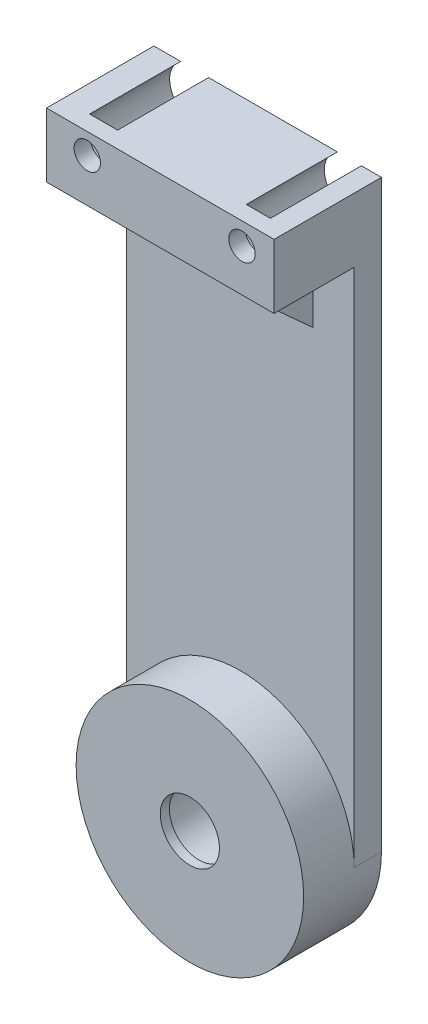
ISO-10303-21;
HEADER;
FILE_DESCRIPTION(('STEP AP214'),'2;1');
FILE_NAME('part.step','',(''),(''),'','','');
FILE_SCHEMA(('AUTOMOTIVE_DESIGN { 1 0 10303 214 1 1 1 1 }'));
ENDSEC;
DATA;
#1=APPLICATION_CONTEXT('core data for automotive mechanical design processes');
#2=APPLICATION_PROTOCOL_DEFINITION('international standard','automotive_design',2000,#1);
#3=PRODUCT_CONTEXT('',#1,'mechanical');
#4=PRODUCT('Part','Part','',(#3));
#5=PRODUCT_RELATED_PRODUCT_CATEGORY('part','',(#4));
#6=PRODUCT_DEFINITION_FORMATION('','',#4);
#7=PRODUCT_DEFINITION_CONTEXT('part definition',#1,'design');
#8=PRODUCT_DEFINITION('design','',#6,#7);
#9=PRODUCT_DEFINITION_SHAPE('','',#8);
#10=(LENGTH_UNIT() NAMED_UNIT(*) SI_UNIT(.MILLI.,.METRE.));
#11=(NAMED_UNIT(*) PLANE_ANGLE_UNIT() SI_UNIT($,.RADIAN.));
#12=(NAMED_UNIT(*) SI_UNIT($,.STERADIAN.) SOLID_ANGLE_UNIT());
#13=UNCERTAINTY_MEASURE_WITH_UNIT(LENGTH_MEASURE(1.E-05),#10,'distance_accuracy_value','');
#14=(GEOMETRIC_REPRESENTATION_CONTEXT(3) GLOBAL_UNCERTAINTY_ASSIGNED_CONTEXT((#13)) GLOBAL_UNIT_ASSIGNED_CONTEXT((#10,
#11,#12)) REPRESENTATION_CONTEXT('',''));
#15=CARTESIAN_POINT('',(0.,0.,0.));
#16=DIRECTION('',(0.,0.,1.));
#17=DIRECTION('',(1.,0.,0.));
#18=AXIS2_PLACEMENT_3D('',#15,#16,#17);
#19=CARTESIAN_POINT('',(0.,57.0691218674891,3.25));
#20=DIRECTION('',(0.,-0.739940073395935,0.672672793996322));
#21=DIRECTION('',(0.,-0.672672793996322,-0.739940073395935));
#22=AXIS2_PLACEMENT_3D('',#19,#20,#21);
#23=PLANE('',#22);
#24=DIRECTION('',(-1.,0.,0.));
#25=VECTOR('',#24,1.);
#26=CARTESIAN_POINT('',(12.0250719766182,57.0691218674891,3.25));
#27=LINE('',#26,#25);
#28=CARTESIAN_POINT('',(7.5,57.0691218674891,3.25));
#29=VERTEX_POINT('',#28);
#30=CARTESIAN_POINT('',(4.5,57.0691218674891,3.25));
#31=VERTEX_POINT('',#30);
#32=EDGE_CURVE('E169',#29,#31,#27,.T.);
#33=ORIENTED_EDGE('',*,*,#32,.T.);
#34=DIRECTION('',(0.,0.672672793996322,0.739940073395935));
#35=VECTOR('',#34,1.);
#36=CARTESIAN_POINT('',(4.5,53.4497101027831,-0.731352941176484));
#37=LINE('',#36,#35);
#38=CARTESIAN_POINT('',(4.5,49.0691218674891,-5.54999999999978));
#39=VERTEX_POINT('',#38);
#40=EDGE_CURVE('E157',#39,#31,#37,.T.);
#41=ORIENTED_EDGE('',*,*,#40,.F.);
#42=DIRECTION('',(-1.,0.,0.));
#43=VECTOR('',#42,1.);
#44=CARTESIAN_POINT('',(-0.47492802338186,49.0691218674891,-5.54999999999978));
#45=LINE('',#44,#43);
#46=CARTESIAN_POINT('',(7.5,49.0691218674891,-5.54999999999978));
#47=VERTEX_POINT('',#46);
#48=EDGE_CURVE('E167',#47,#39,#45,.T.);
#49=ORIENTED_EDGE('',*,*,#48,.F.);
#50=DIRECTION('',(0.,-0.672672793996322,-0.739940073395935));
#51=VECTOR('',#50,1.);
#52=CARTESIAN_POINT('',(7.5,57.0691218674891,3.25));
#53=LINE('',#52,#51);
#54=EDGE_CURVE('E401',#29,#47,#53,.T.);
#55=ORIENTED_EDGE('',*,*,#54,.F.);
#56=EDGE_LOOP('',(#33,#41,#49,#55));
#57=FACE_BOUND('',#56,.T.);
#58=ADVANCED_FACE('F37',(#57),#23,.T.);
#59=CARTESIAN_POINT('',(-4.5,49.0691218674891,-5.54999999999978));
#60=VERTEX_POINT('',#59);
#61=CARTESIAN_POINT('',(-7.5,49.0691218674891,-5.54999999999978));
#62=VERTEX_POINT('',#61);
#63=EDGE_CURVE('E173',#60,#62,#45,.T.);
#64=ORIENTED_EDGE('',*,*,#63,.F.);
#65=DIRECTION('',(0.,-0.672672793996322,-0.739940073395935));
#66=VECTOR('',#65,1.);
#67=CARTESIAN_POINT('',(-4.5,53.4497101027831,-0.731352941176484));
#68=LINE('',#67,#66);
#69=CARTESIAN_POINT('',(-4.5,57.0691218674891,3.25));
#70=VERTEX_POINT('',#69);
#71=EDGE_CURVE('E54',#70,#60,#68,.T.);
#72=ORIENTED_EDGE('',*,*,#71,.F.);
#73=CARTESIAN_POINT('',(-7.5,57.0691218674891,3.25));
#74=VERTEX_POINT('',#73);
#75=EDGE_CURVE('E202',#70,#74,#27,.T.);
#76=ORIENTED_EDGE('',*,*,#75,.T.);
#77=DIRECTION('',(0.,-0.672672793996322,-0.739940073395935));
#78=VECTOR('',#77,1.);
#79=CARTESIAN_POINT('',(-7.5,57.0691218674891,3.25));
#80=LINE('',#79,#78);
#81=EDGE_CURVE('E400',#74,#62,#80,.T.);
#82=ORIENTED_EDGE('',*,*,#81,.T.);
#83=EDGE_LOOP('',(#64,#72,#76,#82));
#84=FACE_BOUND('',#83,.T.);
#85=ADVANCED_FACE('F317',(#84),#23,.T.);
#86=CARTESIAN_POINT('',(12.0250719766182,57.0691218674891,29.2253185801274));
#87=DIRECTION('',(0.,-1.,0.));
#88=DIRECTION('',(0.,0.,-1.));
#89=AXIS2_PLACEMENT_3D('',#86,#87,#88);
#90=PLANE('',#89);
#91=DIRECTION('',(-1.,0.,0.));
#92=VECTOR('',#91,1.);
#93=CARTESIAN_POINT('',(-0.47492802338186,57.0691218674891,-5.54999999999978));
#94=LINE('',#93,#92);
#95=CARTESIAN_POINT('',(-7.5,57.0691218674891,-5.54999999999978));
#96=VERTEX_POINT('',#95);
#97=CARTESIAN_POINT('',(-12.9749280233819,57.0691218674891,-5.54999999999978));
#98=VERTEX_POINT('',#97);
#99=EDGE_CURVE('E248',#96,#98,#94,.T.);
#100=ORIENTED_EDGE('',*,*,#99,.F.);
#101=DIRECTION('',(0.,0.,1.));
#102=VECTOR('',#101,1.);
#103=CARTESIAN_POINT('',(-7.5,57.0691218674891,29.2253185801274));
#104=LINE('',#103,#102);
#105=EDGE_CURVE('E408',#96,#74,#104,.T.);
#106=ORIENTED_EDGE('',*,*,#105,.T.);
#107=CARTESIAN_POINT('',(-12.9749280233819,57.0691218674891,3.25));
#108=VERTEX_POINT('',#107);
#109=EDGE_CURVE('E197',#74,#108,#27,.T.);
#110=ORIENTED_EDGE('',*,*,#109,.T.);
#111=DIRECTION('',(0.,0.,-1.));
#112=VECTOR('',#111,1.);
#113=CARTESIAN_POINT('',(-12.9749280233819,57.0691218674891,29.2253185801274));
#114=LINE('',#113,#112);
#115=EDGE_CURVE('E201',#108,#98,#114,.T.);
#116=ORIENTED_EDGE('',*,*,#115,.T.);
#117=EDGE_LOOP('',(#100,#106,#110,#116));
#118=FACE_BOUND('',#117,.T.);
#119=ADVANCED_FACE('F322',(#118),#90,.T.);
#120=CARTESIAN_POINT('',(-0.474928023381861,-0.0634250947390003,0.));
#121=DIRECTION('',(0.,0.,1.));
#122=DIRECTION('',(1.,0.,0.));
#123=AXIS2_PLACEMENT_3D('',#120,#121,#122);
#124=PLANE('',#123);
#125=CARTESIAN_POINT('',(-0.47492802338186,-0.0634250947390004,0.));
#126=DIRECTION('',(0.,0.,1.));
#127=DIRECTION('',(1.,0.,0.));
#128=AXIS2_PLACEMENT_3D('',#125,#126,#127);
#129=CIRCLE('',#128,3.25);
#130=CARTESIAN_POINT('',(-3.72492802338187,-0.0634250947390004,0.));
#131=VERTEX_POINT('',#130);
#132=EDGE_CURVE('E381',#131,#131,#129,.T.);
#133=ORIENTED_EDGE('',*,*,#132,.F.);
#134=EDGE_LOOP('',(#133));
#135=FACE_BOUND('',#134,.T.);
#136=CARTESIAN_POINT('',(-0.474928023381861,-0.0634250947390003,0.));
#137=DIRECTION('',(0.,0.,1.));
#138=DIRECTION('',(1.,0.,0.));
#139=AXIS2_PLACEMENT_3D('',#136,#137,#138);
#140=CIRCLE('',#139,12.5000000000001);
#141=CARTESIAN_POINT('',(12.0250719766182,-0.0634250947390003,0.));
#142=VERTEX_POINT('',#141);
#143=EDGE_CURVE('E242',#142,#142,#140,.T.);
#144=ORIENTED_EDGE('',*,*,#143,.T.);
#145=EDGE_LOOP('',(#144));
#146=FACE_BOUND('',#145,.T.);
#147=ADVANCED_FACE('F369',(#135,#146),#124,.T.);
#148=CARTESIAN_POINT('',(-0.474928023381861,-0.0634250947390003,-42.9053390593274));
#149=DIRECTION('',(0.,0.,1.));
#150=DIRECTION('',(1.,0.,0.));
#151=AXIS2_PLACEMENT_3D('',#148,#149,#150);
#152=CYLINDRICAL_SURFACE('',#151,12.5000000000001);
#153=ORIENTED_EDGE('',*,*,#143,.F.);
#154=EDGE_LOOP('',(#153));
#155=FACE_BOUND('',#154,.T.);
#156=CARTESIAN_POINT('',(-0.474928023381861,-0.0634250947390003,-5.54999999999978));
#157=DIRECTION('',(0.,0.,-1.));
#158=DIRECTION('',(0.,1.,0.));
#159=AXIS2_PLACEMENT_3D('',#156,#157,#158);
#160=CIRCLE('',#159,12.5000000000001);
#161=CARTESIAN_POINT('',(12.0250719766182,-0.0634250947390005,-5.54999999999978));
#162=VERTEX_POINT('',#161);
#163=CARTESIAN_POINT('',(-12.9749280233819,-0.0634250947390003,-5.54999999999978));
#164=VERTEX_POINT('',#163);
#165=EDGE_CURVE('E245',#162,#164,#160,.F.);
#166=ORIENTED_EDGE('',*,*,#165,.T.);
#167=DIRECTION('',(0.,0.,1.));
#168=VECTOR('',#167,1.);
#169=CARTESIAN_POINT('',(-12.9749280233819,-0.0634250947390005,-8.54999999999978));
#170=LINE('',#169,#168);
#171=CARTESIAN_POINT('',(-12.9749280233819,-0.0634250947390005,-8.54999999999978));
#172=VERTEX_POINT('',#171);
#173=EDGE_CURVE('E240',#172,#164,#170,.T.);
#174=ORIENTED_EDGE('',*,*,#173,.F.);
#175=CARTESIAN_POINT('',(-0.47492802338186,-0.0634250947390005,-8.54999999999978));
#176=DIRECTION('',(0.,0.,-1.));
#177=DIRECTION('',(-1.,0.,0.));
#178=AXIS2_PLACEMENT_3D('',#175,#176,#177);
#179=CIRCLE('',#178,12.5000000000001);
#180=CARTESIAN_POINT('',(12.0250719766182,-0.0634250947390005,-8.54999999999978));
#181=VERTEX_POINT('',#180);
#182=EDGE_CURVE('E216',#181,#172,#179,.T.);
#183=ORIENTED_EDGE('',*,*,#182,.F.);
#184=DIRECTION('',(0.,0.,1.));
#185=VECTOR('',#184,1.);
#186=CARTESIAN_POINT('',(12.0250719766182,-0.0634250947390005,-8.54999999999978));
#187=LINE('',#186,#185);
#188=EDGE_CURVE('E229',#181,#162,#187,.T.);
#189=ORIENTED_EDGE('',*,*,#188,.T.);
#190=EDGE_LOOP('',(#166,#174,#183,#189));
#191=FACE_BOUND('',#190,.T.);
#192=ADVANCED_FACE('F39',(#155,#191),#152,.T.);
#193=CARTESIAN_POINT('',(-12.9749280233819,-0.0634250947390005,-8.54999999999978));
#194=DIRECTION('',(1.,0.,0.));
#195=DIRECTION('',(0.,0.,-1.));
#196=AXIS2_PLACEMENT_3D('',#193,#194,#195);
#197=PLANE('',#196);
#198=DIRECTION('',(0.,1.,0.));
#199=VECTOR('',#198,1.);
#200=CARTESIAN_POINT('',(-12.9749280233819,-0.0634250947390005,-5.54999999999978));
#201=LINE('',#200,#199);
#202=EDGE_CURVE('E215',#164,#98,#201,.T.);
#203=ORIENTED_EDGE('',*,*,#202,.T.);
#204=ORIENTED_EDGE('',*,*,#115,.F.);
#205=DIRECTION('',(0.,1.,0.));
#206=VECTOR('',#205,1.);
#207=CARTESIAN_POINT('',(-12.9749280233819,57.0691218674891,3.25));
#208=LINE('',#207,#206);
#209=CARTESIAN_POINT('',(-12.9749280233819,64.1201625948642,3.25));
#210=VERTEX_POINT('',#209);
#211=EDGE_CURVE('E209',#108,#210,#208,.T.);
#212=ORIENTED_EDGE('',*,*,#211,.T.);
#213=DIRECTION('',(0.,0.,1.));
#214=VECTOR('',#213,1.);
#215=CARTESIAN_POINT('',(-12.9749280233819,64.1201625948642,-8.54999999999978));
#216=LINE('',#215,#214);
#217=CARTESIAN_POINT('',(-12.9749280233819,64.1201625948642,-8.54999999999978));
#218=VERTEX_POINT('',#217);
#219=EDGE_CURVE('E238',#218,#210,#216,.T.);
#220=ORIENTED_EDGE('',*,*,#219,.F.);
#221=DIRECTION('',(0.,1.,0.));
#222=VECTOR('',#221,1.);
#223=CARTESIAN_POINT('',(-12.9749280233819,-0.0634250947390005,-8.54999999999978));
#224=LINE('',#223,#222);
#225=EDGE_CURVE('E219',#172,#218,#224,.T.);
#226=ORIENTED_EDGE('',*,*,#225,.F.);
#227=ORIENTED_EDGE('',*,*,#173,.T.);
#228=EDGE_LOOP('',(#203,#204,#212,#220,#226,#227));
#229=FACE_BOUND('',#228,.T.);
#230=ADVANCED_FACE('F292',(#229),#197,.F.);
#231=CARTESIAN_POINT('',(-12.9749280233819,64.1201625948642,-8.54999999999978));
#232=DIRECTION('',(0.,-1.,0.));
#233=DIRECTION('',(0.,0.,-1.));
#234=AXIS2_PLACEMENT_3D('',#231,#232,#233);
#235=PLANE('',#234);
#236=DIRECTION('',(-1.,0.,0.));
#237=VECTOR('',#236,1.);
#238=CARTESIAN_POINT('',(-12.9749280233819,64.1201625948642,1.45000000000022));
#239=LINE('',#238,#237);
#240=CARTESIAN_POINT('',(9.81969619357984,64.1201625948642,1.45000000000022));
#241=VERTEX_POINT('',#240);
#242=CARTESIAN_POINT('',(7.17930210556199,64.1201625948642,1.45000000000022));
#243=VERTEX_POINT('',#242);
#244=EDGE_CURVE('E259',#241,#243,#239,.T.);
#245=ORIENTED_EDGE('',*,*,#244,.T.);
#246=DIRECTION('',(0.,0.,-1.));
#247=VECTOR('',#246,1.);
#248=CARTESIAN_POINT('',(7.17930210556198,64.1201625948642,-8.54999999999978));
#249=LINE('',#248,#247);
#250=CARTESIAN_POINT('',(7.17930210556198,64.1201625948642,-8.54999999999978));
#251=VERTEX_POINT('',#250);
#252=EDGE_CURVE('E46',#243,#251,#249,.T.);
#253=ORIENTED_EDGE('',*,*,#252,.T.);
#254=DIRECTION('',(1.,0.,0.));
#255=VECTOR('',#254,1.);
#256=CARTESIAN_POINT('',(-12.9749280233819,64.1201625948642,-8.54999999999978));
#257=LINE('',#256,#255);
#258=CARTESIAN_POINT('',(-6.96523827191302,64.1201625948642,-8.54999999999978));
#259=VERTEX_POINT('',#258);
#260=EDGE_CURVE('E227',#259,#251,#257,.T.);
#261=ORIENTED_EDGE('',*,*,#260,.F.);
#262=DIRECTION('',(0.,0.,-1.));
#263=VECTOR('',#262,1.);
#264=CARTESIAN_POINT('',(-6.96523827191302,64.1201625948642,-8.54999999999978));
#265=LINE('',#264,#263);
#266=CARTESIAN_POINT('',(-6.96523827191302,64.1201625948642,1.45000000000022));
#267=VERTEX_POINT('',#266);
#268=EDGE_CURVE('E251',#259,#267,#265,.F.);
#269=ORIENTED_EDGE('',*,*,#268,.T.);
#270=DIRECTION('',(-1.,0.,0.));
#271=VECTOR('',#270,1.);
#272=CARTESIAN_POINT('',(-12.9749280233819,64.1201625948642,1.45000000000022));
#273=LINE('',#272,#271);
#274=CARTESIAN_POINT('',(-10.0347617280894,64.1201625948642,1.45000000000022));
#275=VERTEX_POINT('',#274);
#276=EDGE_CURVE('E254',#267,#275,#273,.T.);
#277=ORIENTED_EDGE('',*,*,#276,.T.);
#278=DIRECTION('',(0.,0.,-1.));
#279=VECTOR('',#278,1.);
#280=CARTESIAN_POINT('',(-10.0347617280894,64.1201625948642,-8.54999999999978));
#281=LINE('',#280,#279);
#282=CARTESIAN_POINT('',(-10.0347617280894,64.1201625948642,-8.54999999999978));
#283=VERTEX_POINT('',#282);
#284=EDGE_CURVE('E256',#275,#283,#281,.T.);
#285=ORIENTED_EDGE('',*,*,#284,.T.);
#286=EDGE_CURVE('E223',#218,#283,#257,.T.);
#287=ORIENTED_EDGE('',*,*,#286,.F.);
#288=ORIENTED_EDGE('',*,*,#219,.T.);
#289=DIRECTION('',(1.,0.,0.));
#290=VECTOR('',#289,1.);
#291=CARTESIAN_POINT('',(12.0250719766182,64.1201625948642,3.24999999999999));
#292=LINE('',#291,#290);
#293=CARTESIAN_POINT('',(12.0250719766182,64.1201625948642,3.24999999999999));
#294=VERTEX_POINT('',#293);
#295=EDGE_CURVE('E207',#210,#294,#292,.T.);
#296=ORIENTED_EDGE('',*,*,#295,.T.);
#297=DIRECTION('',(0.,0.,1.));
#298=VECTOR('',#297,1.);
#299=CARTESIAN_POINT('',(12.0250719766182,64.1201625948642,-8.54999999999978));
#300=LINE('',#299,#298);
#301=CARTESIAN_POINT('',(12.0250719766182,64.1201625948642,-8.54999999999978));
#302=VERTEX_POINT('',#301);
#303=EDGE_CURVE('E235',#302,#294,#300,.T.);
#304=ORIENTED_EDGE('',*,*,#303,.F.);
#305=CARTESIAN_POINT('',(9.81969619357984,64.1201625948642,-8.54999999999978));
#306=VERTEX_POINT('',#305);
#307=EDGE_CURVE('E222',#306,#302,#257,.T.);
#308=ORIENTED_EDGE('',*,*,#307,.F.);
#309=DIRECTION('',(0.,0.,-1.));
#310=VECTOR('',#309,1.);
#311=CARTESIAN_POINT('',(9.81969619357984,64.1201625948642,-8.54999999999978));
#312=LINE('',#311,#310);
#313=EDGE_CURVE('E262',#306,#241,#312,.F.);
#314=ORIENTED_EDGE('',*,*,#313,.T.);
#315=EDGE_LOOP('',(#245,#253,#261,#269,#277,#285,#287,#288,#296,#304,#308,#314));
#316=FACE_BOUND('',#315,.T.);
#317=ADVANCED_FACE('F269',(#316),#235,.F.);
#318=CARTESIAN_POINT('',(12.0250719766182,-0.0634250947390005,-8.54999999999978));
#319=DIRECTION('',(-1.,0.,0.));
#320=DIRECTION('',(0.,0.,1.));
#321=AXIS2_PLACEMENT_3D('',#318,#319,#320);
#322=PLANE('',#321);
#323=ORIENTED_EDGE('',*,*,#188,.F.);
#324=DIRECTION('',(0.,-1.,0.));
#325=VECTOR('',#324,1.);
#326=CARTESIAN_POINT('',(12.0250719766182,-0.0634250947390005,-8.54999999999978));
#327=LINE('',#326,#325);
#328=EDGE_CURVE('E226',#302,#181,#327,.T.);
#329=ORIENTED_EDGE('',*,*,#328,.F.);
#330=ORIENTED_EDGE('',*,*,#303,.T.);
#331=DIRECTION('',(0.,-1.,0.));
#332=VECTOR('',#331,1.);
#333=CARTESIAN_POINT('',(12.0250719766182,64.1201625948642,3.24999999999999));
#334=LINE('',#333,#332);
#335=CARTESIAN_POINT('',(12.0250719766182,57.0691218674891,3.25));
#336=VERTEX_POINT('',#335);
#337=EDGE_CURVE('E203',#294,#336,#334,.T.);
#338=ORIENTED_EDGE('',*,*,#337,.T.);
#339=DIRECTION('',(0.,0.,-1.));
#340=VECTOR('',#339,1.);
#341=CARTESIAN_POINT('',(12.0250719766182,57.0691218674891,29.2253185801274));
#342=LINE('',#341,#340);
#343=CARTESIAN_POINT('',(12.0250719766182,57.0691218674891,-5.54999999999978));
#344=VERTEX_POINT('',#343);
#345=EDGE_CURVE('E206',#336,#344,#342,.T.);
#346=ORIENTED_EDGE('',*,*,#345,.T.);
#347=DIRECTION('',(0.,-1.,0.));
#348=VECTOR('',#347,1.);
#349=CARTESIAN_POINT('',(12.0250719766182,-0.0634250947390005,-5.54999999999978));
#350=LINE('',#349,#348);
#351=EDGE_CURVE('E220',#344,#162,#350,.T.);
#352=ORIENTED_EDGE('',*,*,#351,.T.);
#353=EDGE_LOOP('',(#323,#329,#330,#338,#346,#352));
#354=FACE_BOUND('',#353,.T.);
#355=ADVANCED_FACE('F283',(#354),#322,.F.);
#356=CARTESIAN_POINT('',(-0.47492802338186,-0.0634250947390005,-8.54999999999978));
#357=DIRECTION('',(0.,0.,-1.));
#358=DIRECTION('',(-1.,0.,0.));
#359=AXIS2_PLACEMENT_3D('',#356,#357,#358);
#360=PLANE('',#359);
#361=CARTESIAN_POINT('',(-0.47492802338186,-0.0634250947390004,-8.54999999999978));
#362=DIRECTION('',(0.,0.,-1.));
#363=DIRECTION('',(-1.,0.,0.));
#364=AXIS2_PLACEMENT_3D('',#361,#362,#363);
#365=CIRCLE('',#364,4.00000000000001);
#366=CARTESIAN_POINT('',(-4.47492802338187,-0.0634250947390004,-8.54999999999978));
#367=VERTEX_POINT('',#366);
#368=EDGE_CURVE('E450',#367,#367,#365,.T.);
#369=ORIENTED_EDGE('',*,*,#368,.F.);
#370=EDGE_LOOP('',(#369));
#371=FACE_BOUND('',#370,.T.);
#372=ORIENTED_EDGE('',*,*,#260,.T.);
#373=CARTESIAN_POINT('',(8.49949914957091,61.7077820765815,-8.54999999999978));
#374=DIRECTION('',(0.,0.,-1.));
#375=DIRECTION('',(-1.,0.,0.));
#376=AXIS2_PLACEMENT_3D('',#373,#374,#375);
#377=CIRCLE('',#376,2.75);
#378=EDGE_CURVE('E12',#306,#251,#377,.T.);
#379=ORIENTED_EDGE('',*,*,#378,.F.);
#380=ORIENTED_EDGE('',*,*,#307,.T.);
#381=ORIENTED_EDGE('',*,*,#328,.T.);
#382=ORIENTED_EDGE('',*,*,#182,.T.);
#383=ORIENTED_EDGE('',*,*,#225,.T.);
#384=ORIENTED_EDGE('',*,*,#286,.T.);
#385=CARTESIAN_POINT('',(-8.50000000000123,61.838275998647,-8.54999999999978));
#386=DIRECTION('',(0.,0.,-1.));
#387=DIRECTION('',(-1.,0.,0.));
#388=AXIS2_PLACEMENT_3D('',#385,#386,#387);
#389=CIRCLE('',#388,2.75);
#390=EDGE_CURVE('E186',#259,#283,#389,.T.);
#391=ORIENTED_EDGE('',*,*,#390,.F.);
#392=EDGE_LOOP('',(#372,#379,#380,#381,#382,#383,#384,#391));
#393=FACE_BOUND('',#392,.T.);
#394=ADVANCED_FACE('F275',(#371,#393),#360,.T.);
#395=CARTESIAN_POINT('',(-0.47492802338186,-0.0634250947390005,-5.54999999999978));
#396=DIRECTION('',(0.,0.,-1.));
#397=DIRECTION('',(-1.,0.,0.));
#398=AXIS2_PLACEMENT_3D('',#395,#396,#397);
#399=PLANE('',#398);
#400=CARTESIAN_POINT('',(7.5,57.0691218674891,-5.54999999999978));
#401=VERTEX_POINT('',#400);
#402=EDGE_CURVE('E249',#344,#401,#94,.T.);
#403=ORIENTED_EDGE('',*,*,#402,.T.);
#404=DIRECTION('',(0.,-1.,0.));
#405=VECTOR('',#404,1.);
#406=CARTESIAN_POINT('',(7.5,-0.0634250947390005,-5.54999999999978));
#407=LINE('',#406,#405);
#408=EDGE_CURVE('E62',#401,#47,#407,.T.);
#409=ORIENTED_EDGE('',*,*,#408,.T.);
#410=ORIENTED_EDGE('',*,*,#48,.T.);
#411=DIRECTION('',(0.,1.,0.));
#412=VECTOR('',#411,1.);
#413=CARTESIAN_POINT('',(4.5,49.0691218674891,-5.54999999999978));
#414=LINE('',#413,#412);
#415=CARTESIAN_POINT('',(4.5,57.0691218674891,-5.54999999999978));
#416=VERTEX_POINT('',#415);
#417=EDGE_CURVE('E154',#39,#416,#414,.T.);
#418=ORIENTED_EDGE('',*,*,#417,.T.);
#419=DIRECTION('',(-1.,0.,0.));
#420=VECTOR('',#419,1.);
#421=CARTESIAN_POINT('',(4.5,57.0691218674891,-5.54999999999978));
#422=LINE('',#421,#420);
#423=CARTESIAN_POINT('',(-4.5,57.0691218674891,-5.54999999999978));
#424=VERTEX_POINT('',#423);
#425=EDGE_CURVE('E162',#416,#424,#422,.T.);
#426=ORIENTED_EDGE('',*,*,#425,.T.);
#427=DIRECTION('',(0.,-1.,0.));
#428=VECTOR('',#427,1.);
#429=CARTESIAN_POINT('',(-4.49999999999999,49.0691218674891,-5.54999999999978));
#430=LINE('',#429,#428);
#431=EDGE_CURVE('E395',#424,#60,#430,.T.);
#432=ORIENTED_EDGE('',*,*,#431,.T.);
#433=ORIENTED_EDGE('',*,*,#63,.T.);
#434=DIRECTION('',(0.,-1.,0.));
#435=VECTOR('',#434,1.);
#436=CARTESIAN_POINT('',(-7.5,-0.0634250947390005,-5.54999999999978));
#437=LINE('',#436,#435);
#438=EDGE_CURVE('E177',#96,#62,#437,.T.);
#439=ORIENTED_EDGE('',*,*,#438,.F.);
#440=ORIENTED_EDGE('',*,*,#99,.T.);
#441=ORIENTED_EDGE('',*,*,#202,.F.);
#442=ORIENTED_EDGE('',*,*,#165,.F.);
#443=ORIENTED_EDGE('',*,*,#351,.F.);
#444=EDGE_LOOP('',(#403,#409,#410,#418,#426,#432,#433,#439,#440,#441,#442,#443));
#445=FACE_BOUND('',#444,.T.);
#446=ADVANCED_FACE('F171',(#445),#399,.F.);
#447=DIRECTION('',(0.,0.,1.));
#448=VECTOR('',#447,1.);
#449=CARTESIAN_POINT('',(7.5,57.0691218674891,29.2253185801274));
#450=LINE('',#449,#448);
#451=EDGE_CURVE('E403',#401,#29,#450,.T.);
#452=ORIENTED_EDGE('',*,*,#451,.F.);
#453=ORIENTED_EDGE('',*,*,#402,.F.);
#454=ORIENTED_EDGE('',*,*,#345,.F.);
#455=EDGE_CURVE('E198',#336,#29,#27,.T.);
#456=ORIENTED_EDGE('',*,*,#455,.T.);
#457=EDGE_LOOP('',(#452,#453,#454,#456));
#458=FACE_BOUND('',#457,.T.);
#459=ADVANCED_FACE('F311',(#458),#90,.T.);
#460=CARTESIAN_POINT('',(-18.5409663715559,58.1032415509736,3.25));
#461=DIRECTION('',(0.,0.,1.));
#462=DIRECTION('',(0.999970538210126,-0.00767611306267934,0.));
#463=AXIS2_PLACEMENT_3D('',#460,#461,#462);
#464=PLANE('',#463);
#465=CARTESIAN_POINT('',(8.49949914957091,61.7077820765815,3.24999999999999));
#466=DIRECTION('',(0.,0.,1.));
#467=DIRECTION('',(1.,0.,0.));
#468=AXIS2_PLACEMENT_3D('',#465,#466,#467);
#469=CIRCLE('',#468,1.45);
#470=CARTESIAN_POINT('',(9.94949914957091,61.7077820765815,3.24999999999999));
#471=VERTEX_POINT('',#470);
#472=EDGE_CURVE('E183',#471,#471,#469,.T.);
#473=ORIENTED_EDGE('',*,*,#472,.F.);
#474=EDGE_LOOP('',(#473));
#475=FACE_BOUND('',#474,.T.);
#476=ORIENTED_EDGE('',*,*,#32,.F.);
#477=ORIENTED_EDGE('',*,*,#455,.F.);
#478=ORIENTED_EDGE('',*,*,#337,.F.);
#479=ORIENTED_EDGE('',*,*,#295,.F.);
#480=ORIENTED_EDGE('',*,*,#211,.F.);
#481=ORIENTED_EDGE('',*,*,#109,.F.);
#482=ORIENTED_EDGE('',*,*,#75,.F.);
#483=DIRECTION('',(-1.,0.,0.));
#484=VECTOR('',#483,1.);
#485=CARTESIAN_POINT('',(12.0250719766182,57.0691218674891,3.25));
#486=LINE('',#485,#484);
#487=EDGE_CURVE('E384',#31,#70,#486,.T.);
#488=ORIENTED_EDGE('',*,*,#487,.F.);
#489=EDGE_LOOP('',(#476,#477,#478,#479,#480,#481,#482,#488));
#490=FACE_BOUND('',#489,.T.);
#491=CARTESIAN_POINT('',(-8.50000000000123,61.838275998647,3.25));
#492=DIRECTION('',(0.,0.,1.));
#493=DIRECTION('',(1.,0.,0.));
#494=AXIS2_PLACEMENT_3D('',#491,#492,#493);
#495=CIRCLE('',#494,1.45);
#496=CARTESIAN_POINT('',(-7.05000000000123,61.838275998647,3.25));
#497=VERTEX_POINT('',#496);
#498=EDGE_CURVE('E194',#497,#497,#495,.T.);
#499=ORIENTED_EDGE('',*,*,#498,.F.);
#500=EDGE_LOOP('',(#499));
#501=FACE_BOUND('',#500,.T.);
#502=ADVANCED_FACE('F302',(#475,#490,#501),#464,.T.);
#503=CARTESIAN_POINT('',(-7.05000000000123,61.838275998647,1.45000000000022));
#504=DIRECTION('',(0.,0.,1.));
#505=DIRECTION('',(1.,0.,0.));
#506=AXIS2_PLACEMENT_3D('',#503,#504,#505);
#507=PLANE('',#506);
#508=CARTESIAN_POINT('',(-8.50000000000123,61.838275998647,1.45000000000022));
#509=DIRECTION('',(0.,0.,-1.));
#510=DIRECTION('',(-1.,0.,0.));
#511=AXIS2_PLACEMENT_3D('',#508,#509,#510);
#512=CIRCLE('',#511,1.45);
#513=CARTESIAN_POINT('',(-9.95000000000123,61.838275998647,1.45000000000022));
#514=VERTEX_POINT('',#513);
#515=EDGE_CURVE('E191',#514,#514,#512,.T.);
#516=ORIENTED_EDGE('',*,*,#515,.F.);
#517=EDGE_LOOP('',(#516));
#518=FACE_BOUND('',#517,.T.);
#519=CARTESIAN_POINT('',(-8.50000000000123,61.838275998647,1.45000000000022));
#520=DIRECTION('',(0.,0.,-1.));
#521=DIRECTION('',(-1.,0.,0.));
#522=AXIS2_PLACEMENT_3D('',#519,#520,#521);
#523=CIRCLE('',#522,2.75);
#524=EDGE_CURVE('E188',#267,#275,#523,.T.);
#525=ORIENTED_EDGE('',*,*,#524,.T.);
#526=ORIENTED_EDGE('',*,*,#276,.F.);
#527=EDGE_LOOP('',(#525,#526));
#528=FACE_BOUND('',#527,.T.);
#529=ADVANCED_FACE('F300',(#518,#528),#507,.F.);
#530=CARTESIAN_POINT('',(-8.50000000000123,61.838275998647,-8.54999999999978));
#531=DIRECTION('',(0.,0.,-1.));
#532=DIRECTION('',(-1.,0.,0.));
#533=AXIS2_PLACEMENT_3D('',#530,#531,#532);
#534=CYLINDRICAL_SURFACE('',#533,2.75);
#535=ORIENTED_EDGE('',*,*,#390,.T.);
#536=ORIENTED_EDGE('',*,*,#284,.F.);
#537=ORIENTED_EDGE('',*,*,#524,.F.);
#538=ORIENTED_EDGE('',*,*,#268,.F.);
#539=EDGE_LOOP('',(#535,#536,#537,#538));
#540=FACE_BOUND('',#539,.T.);
#541=ADVANCED_FACE('F298',(#540),#534,.F.);
#542=CARTESIAN_POINT('',(-8.50000000000123,61.838275998647,-8.54999999999978));
#543=DIRECTION('',(0.,0.,-1.));
#544=DIRECTION('',(-1.,0.,0.));
#545=AXIS2_PLACEMENT_3D('',#542,#543,#544);
#546=CYLINDRICAL_SURFACE('',#545,1.45);
#547=ORIENTED_EDGE('',*,*,#498,.T.);
#548=EDGE_LOOP('',(#547));
#549=FACE_BOUND('',#548,.T.);
#550=ORIENTED_EDGE('',*,*,#515,.T.);
#551=EDGE_LOOP('',(#550));
#552=FACE_BOUND('',#551,.T.);
#553=ADVANCED_FACE('F309',(#549,#552),#546,.F.);
#554=CARTESIAN_POINT('',(8.49949914957091,61.7077820765815,-8.54999999999978));
#555=DIRECTION('',(0.,0.,-1.));
#556=DIRECTION('',(-1.,0.,0.));
#557=AXIS2_PLACEMENT_3D('',#554,#555,#556);
#558=CYLINDRICAL_SURFACE('',#557,2.75);
#559=ORIENTED_EDGE('',*,*,#378,.T.);
#560=ORIENTED_EDGE('',*,*,#252,.F.);
#561=CARTESIAN_POINT('',(8.49949914957091,61.7077820765815,1.45000000000022));
#562=DIRECTION('',(0.,0.,-1.));
#563=DIRECTION('',(-1.,0.,0.));
#564=AXIS2_PLACEMENT_3D('',#561,#562,#563);
#565=CIRCLE('',#564,2.75);
#566=EDGE_CURVE('E172',#241,#243,#565,.T.);
#567=ORIENTED_EDGE('',*,*,#566,.F.);
#568=ORIENTED_EDGE('',*,*,#313,.F.);
#569=EDGE_LOOP('',(#559,#560,#567,#568));
#570=FACE_BOUND('',#569,.T.);
#571=ADVANCED_FACE('F328',(#570),#558,.F.);
#572=CARTESIAN_POINT('',(9.94949914957091,61.7077820765815,1.45000000000022));
#573=DIRECTION('',(0.,0.,1.));
#574=DIRECTION('',(1.,0.,0.));
#575=AXIS2_PLACEMENT_3D('',#572,#573,#574);
#576=PLANE('',#575);
#577=CARTESIAN_POINT('',(8.49949914957091,61.7077820765815,1.45000000000022));
#578=DIRECTION('',(0.,0.,-1.));
#579=DIRECTION('',(-1.,0.,0.));
#580=AXIS2_PLACEMENT_3D('',#577,#578,#579);
#581=CIRCLE('',#580,1.45);
#582=CARTESIAN_POINT('',(7.04949914957092,61.7077820765815,1.45000000000022));
#583=VERTEX_POINT('',#582);
#584=EDGE_CURVE('E175',#583,#583,#581,.T.);
#585=ORIENTED_EDGE('',*,*,#584,.F.);
#586=EDGE_LOOP('',(#585));
#587=FACE_BOUND('',#586,.T.);
#588=ORIENTED_EDGE('',*,*,#566,.T.);
#589=ORIENTED_EDGE('',*,*,#244,.F.);
#590=EDGE_LOOP('',(#588,#589));
#591=FACE_BOUND('',#590,.T.);
#592=ADVANCED_FACE('F331',(#587,#591),#576,.F.);
#593=CARTESIAN_POINT('',(8.49949914957091,61.7077820765815,-8.54999999999978));
#594=DIRECTION('',(0.,0.,-1.));
#595=DIRECTION('',(-1.,0.,0.));
#596=AXIS2_PLACEMENT_3D('',#593,#594,#595);
#597=CYLINDRICAL_SURFACE('',#596,1.45);
#598=ORIENTED_EDGE('',*,*,#472,.T.);
#599=EDGE_LOOP('',(#598));
#600=FACE_BOUND('',#599,.T.);
#601=ORIENTED_EDGE('',*,*,#584,.T.);
#602=EDGE_LOOP('',(#601));
#603=FACE_BOUND('',#602,.T.);
#604=ADVANCED_FACE('F334',(#600,#603),#597,.F.);
#605=CARTESIAN_POINT('',(-7.5,25.7783687500626,-2.64999999999989));
#606=DIRECTION('',(1.,0.,0.));
#607=DIRECTION('',(0.,0.,-1.));
#608=AXIS2_PLACEMENT_3D('',#605,#606,#607);
#609=PLANE('',#608);
#610=ORIENTED_EDGE('',*,*,#105,.F.);
#611=ORIENTED_EDGE('',*,*,#438,.T.);
#612=ORIENTED_EDGE('',*,*,#81,.F.);
#613=EDGE_LOOP('',(#610,#611,#612));
#614=FACE_BOUND('',#613,.T.);
#615=ADVANCED_FACE('F326',(#614),#609,.F.);
#616=CARTESIAN_POINT('',(7.5,25.7783687500626,-2.64999999999989));
#617=DIRECTION('',(1.,0.,0.));
#618=DIRECTION('',(0.,0.,-1.));
#619=AXIS2_PLACEMENT_3D('',#616,#617,#618);
#620=PLANE('',#619);
#621=ORIENTED_EDGE('',*,*,#408,.F.);
#622=ORIENTED_EDGE('',*,*,#451,.T.);
#623=ORIENTED_EDGE('',*,*,#54,.T.);
#624=EDGE_LOOP('',(#621,#622,#623));
#625=FACE_BOUND('',#624,.T.);
#626=ADVANCED_FACE('F341',(#625),#620,.T.);
#627=CARTESIAN_POINT('',(4.5,49.0691218674891,3.251));
#628=DIRECTION('',(-1.,0.,0.));
#629=DIRECTION('',(0.,0.,1.));
#630=AXIS2_PLACEMENT_3D('',#627,#628,#629);
#631=PLANE('',#630);
#632=ORIENTED_EDGE('',*,*,#40,.T.);
#633=DIRECTION('',(0.,0.,-1.));
#634=VECTOR('',#633,1.);
#635=CARTESIAN_POINT('',(4.5,57.0691218674891,3.251));
#636=LINE('',#635,#634);
#637=EDGE_CURVE('E159',#31,#416,#636,.T.);
#638=ORIENTED_EDGE('',*,*,#637,.T.);
#639=ORIENTED_EDGE('',*,*,#417,.F.);
#640=EDGE_LOOP('',(#632,#638,#639));
#641=FACE_BOUND('',#640,.T.);
#642=ADVANCED_FACE('F156',(#641),#631,.T.);
#643=CARTESIAN_POINT('',(4.5,57.0691218674891,3.251));
#644=DIRECTION('',(0.,-1.,0.));
#645=DIRECTION('',(0.,0.,-1.));
#646=AXIS2_PLACEMENT_3D('',#643,#644,#645);
#647=PLANE('',#646);
#648=ORIENTED_EDGE('',*,*,#487,.T.);
#649=DIRECTION('',(0.,0.,-1.));
#650=VECTOR('',#649,1.);
#651=CARTESIAN_POINT('',(-4.5,57.0691218674891,3.251));
#652=LINE('',#651,#650);
#653=EDGE_CURVE('E397',#70,#424,#652,.T.);
#654=ORIENTED_EDGE('',*,*,#653,.T.);
#655=ORIENTED_EDGE('',*,*,#425,.F.);
#656=ORIENTED_EDGE('',*,*,#637,.F.);
#657=EDGE_LOOP('',(#648,#654,#655,#656));
#658=FACE_BOUND('',#657,.T.);
#659=ADVANCED_FACE('F425',(#658),#647,.T.);
#660=CARTESIAN_POINT('',(-4.49999999999999,49.0691218674891,3.251));
#661=DIRECTION('',(1.,0.,0.));
#662=DIRECTION('',(0.,1.,0.));
#663=AXIS2_PLACEMENT_3D('',#660,#661,#662);
#664=PLANE('',#663);
#665=ORIENTED_EDGE('',*,*,#71,.T.);
#666=ORIENTED_EDGE('',*,*,#431,.F.);
#667=ORIENTED_EDGE('',*,*,#653,.F.);
#668=EDGE_LOOP('',(#665,#666,#667));
#669=FACE_BOUND('',#668,.T.);
#670=ADVANCED_FACE('F430',(#669),#664,.T.);
#671=CARTESIAN_POINT('',(-0.47492802338186,-0.0634250947390004,3.25));
#672=DIRECTION('',(0.,0.,-1.));
#673=DIRECTION('',(-1.,0.,0.));
#674=AXIS2_PLACEMENT_3D('',#671,#672,#673);
#675=CYLINDRICAL_SURFACE('',#674,3.25);
#676=CARTESIAN_POINT('',(-0.47492802338186,-0.0634250947390004,-1.));
#677=DIRECTION('',(0.,0.,1.));
#678=DIRECTION('',(1.,0.,0.));
#679=AXIS2_PLACEMENT_3D('',#676,#677,#678);
#680=CIRCLE('',#679,3.25);
#681=CARTESIAN_POINT('',(-3.72492802338187,-0.0634250947390004,-1.));
#682=VERTEX_POINT('',#681);
#683=EDGE_CURVE('E41',#682,#682,#680,.F.);
#684=CARTESIAN_POINT('',(-3.72492802338187,-0.0634250947390004,-1.));
#685=CARTESIAN_POINT('',(-3.72492802338187,-0.0634250947390004,-0.989583333333333));
#686=CARTESIAN_POINT('',(-3.72492802338187,-0.0634250947390004,-0.979166666666667));
#687=CARTESIAN_POINT('',(-3.72492802338187,-0.0634250947390004,-0.958333333333333));
#688=CARTESIAN_POINT('',(-3.72492802338187,-0.0634250947390004,-0.947916666666667));
#689=CARTESIAN_POINT('',(-3.72492802338187,-0.0634250947390004,-0.927083333333333));
#690=CARTESIAN_POINT('',(-3.72492802338187,-0.0634250947390004,-0.916666666666667));
#691=CARTESIAN_POINT('',(-3.72492802338187,-0.0634250947390004,-0.895833333333333));
#692=CARTESIAN_POINT('',(-3.72492802338187,-0.0634250947390004,-0.885416666666667));
#693=CARTESIAN_POINT('',(-3.72492802338187,-0.0634250947390004,-0.864583333333333));
#694=CARTESIAN_POINT('',(-3.72492802338187,-0.0634250947390004,-0.854166666666667));
#695=CARTESIAN_POINT('',(-3.72492802338187,-0.0634250947390004,-0.833333333333333));
#696=CARTESIAN_POINT('',(-3.72492802338187,-0.0634250947390004,-0.822916666666667));
#697=CARTESIAN_POINT('',(-3.72492802338187,-0.0634250947390004,-0.802083333333333));
#698=CARTESIAN_POINT('',(-3.72492802338187,-0.0634250947390004,-0.791666666666667));
#699=CARTESIAN_POINT('',(-3.72492802338187,-0.0634250947390004,-0.770833333333333));
#700=CARTESIAN_POINT('',(-3.72492802338187,-0.0634250947390004,-0.760416666666667));
#701=CARTESIAN_POINT('',(-3.72492802338187,-0.0634250947390004,-0.739583333333333));
#702=CARTESIAN_POINT('',(-3.72492802338187,-0.0634250947390004,-0.729166666666667));
#703=CARTESIAN_POINT('',(-3.72492802338187,-0.0634250947390004,-0.708333333333333));
#704=CARTESIAN_POINT('',(-3.72492802338187,-0.0634250947390004,-0.697916666666666));
#705=CARTESIAN_POINT('',(-3.72492802338187,-0.0634250947390004,-0.677083333333333));
#706=CARTESIAN_POINT('',(-3.72492802338187,-0.0634250947390004,-0.666666666666666));
#707=CARTESIAN_POINT('',(-3.72492802338187,-0.0634250947390004,-0.645833333333333));
#708=CARTESIAN_POINT('',(-3.72492802338187,-0.0634250947390004,-0.635416666666667));
#709=CARTESIAN_POINT('',(-3.72492802338187,-0.0634250947390004,-0.614583333333334));
#710=CARTESIAN_POINT('',(-3.72492802338187,-0.0634250947390004,-0.604166666666667));
#711=CARTESIAN_POINT('',(-3.72492802338187,-0.0634250947390004,-0.583333333333334));
#712=CARTESIAN_POINT('',(-3.72492802338187,-0.0634250947390004,-0.572916666666667));
#713=CARTESIAN_POINT('',(-3.72492802338187,-0.0634250947390004,-0.552083333333334));
#714=CARTESIAN_POINT('',(-3.72492802338187,-0.0634250947390004,-0.541666666666667));
#715=CARTESIAN_POINT('',(-3.72492802338187,-0.0634250947390004,-0.520833333333334));
#716=CARTESIAN_POINT('',(-3.72492802338187,-0.0634250947390004,-0.510416666666667));
#717=CARTESIAN_POINT('',(-3.72492802338187,-0.0634250947390004,-0.489583333333334));
#718=CARTESIAN_POINT('',(-3.72492802338187,-0.0634250947390004,-0.479166666666667));
#719=CARTESIAN_POINT('',(-3.72492802338187,-0.0634250947390004,-0.458333333333334));
#720=CARTESIAN_POINT('',(-3.72492802338187,-0.0634250947390004,-0.447916666666667));
#721=CARTESIAN_POINT('',(-3.72492802338187,-0.0634250947390004,-0.427083333333334));
#722=CARTESIAN_POINT('',(-3.72492802338187,-0.0634250947390004,-0.416666666666667));
#723=CARTESIAN_POINT('',(-3.72492802338187,-0.0634250947390004,-0.395833333333334));
#724=CARTESIAN_POINT('',(-3.72492802338187,-0.0634250947390004,-0.385416666666667));
#725=CARTESIAN_POINT('',(-3.72492802338187,-0.0634250947390004,-0.364583333333334));
#726=CARTESIAN_POINT('',(-3.72492802338187,-0.0634250947390004,-0.354166666666667));
#727=CARTESIAN_POINT('',(-3.72492802338187,-0.0634250947390004,-0.333333333333334));
#728=CARTESIAN_POINT('',(-3.72492802338187,-0.0634250947390004,-0.322916666666667));
#729=CARTESIAN_POINT('',(-3.72492802338187,-0.0634250947390004,-0.302083333333334));
#730=CARTESIAN_POINT('',(-3.72492802338187,-0.0634250947390004,-0.291666666666667));
#731=CARTESIAN_POINT('',(-3.72492802338187,-0.0634250947390004,-0.270833333333334));
#732=CARTESIAN_POINT('',(-3.72492802338187,-0.0634250947390004,-0.260416666666667));
#733=CARTESIAN_POINT('',(-3.72492802338187,-0.0634250947390004,-0.239583333333334));
#734=CARTESIAN_POINT('',(-3.72492802338187,-0.0634250947390004,-0.229166666666667));
#735=CARTESIAN_POINT('',(-3.72492802338187,-0.0634250947390004,-0.208333333333334));
#736=CARTESIAN_POINT('',(-3.72492802338187,-0.0634250947390004,-0.197916666666667));
#737=CARTESIAN_POINT('',(-3.72492802338187,-0.0634250947390004,-0.177083333333334));
#738=CARTESIAN_POINT('',(-3.72492802338187,-0.0634250947390004,-0.166666666666667));
#739=CARTESIAN_POINT('',(-3.72492802338187,-0.0634250947390004,-0.145833333333334));
#740=CARTESIAN_POINT('',(-3.72492802338187,-0.0634250947390004,-0.135416666666667));
#741=CARTESIAN_POINT('',(-3.72492802338187,-0.0634250947390004,-0.114583333333334));
#742=CARTESIAN_POINT('',(-3.72492802338187,-0.0634250947390004,-0.104166666666667));
#743=CARTESIAN_POINT('',(-3.72492802338187,-0.0634250947390004,-0.0833333333333338));
#744=CARTESIAN_POINT('',(-3.72492802338187,-0.0634250947390004,-0.0729166666666672));
#745=CARTESIAN_POINT('',(-3.72492802338187,-0.0634250947390004,-0.0520833333333338));
#746=CARTESIAN_POINT('',(-3.72492802338187,-0.0634250947390004,-0.0416666666666671));
#747=CARTESIAN_POINT('',(-3.72492802338187,-0.0634250947390004,-0.0208333333333338));
#748=CARTESIAN_POINT('',(-3.72492802338187,-0.0634250947390004,-0.0104166666666671));
#749=CARTESIAN_POINT('',(-3.72492802338187,-0.0634250947390004,0.));
#750=B_SPLINE_CURVE_WITH_KNOTS('',3,(#684,#685,#686,#687,#688,#689,#690,#691,#692,#693,#694,
#695,#696,#697,#698,#699,#700,#701,#702,#703,#704,#705,#706,#707,#708,#709,#710,#711,#712,#713,
#714,#715,#716,#717,#718,#719,#720,#721,#722,#723,#724,#725,#726,#727,#728,#729,#730,#731,#732,
#733,#734,#735,#736,#737,#738,#739,#740,#741,#742,#743,#744,#745,#746,#747,#748,#749),
.UNSPECIFIED.,.F.,.F.,(4,2,2,2,2,2,2,2,2,2,2,2,2,2,2,2,2,2,2,2,2,2,2,2,2,2,2,2,2,2,2,2,4),(0.,
0.03125,0.0625000000000001,0.0937500000000001,0.125,0.15625,0.1875,0.21875,0.25,0.28125,0.3125,
0.34375,0.374999999999999,0.40625,0.4375,0.46875,0.5,0.53125,0.5625,0.59375,0.625,0.65625,
0.687499999999999,0.718749999999999,0.749999999999999,0.781249999999999,0.812499999999999,
0.843749999999999,0.874999999999999,0.90625,0.9375,0.96875,1.),.UNSPECIFIED.);
#751=EDGE_CURVE('BSEAM434',#682,#131,#750,.T.);
#752=ORIENTED_EDGE('',*,*,#683,.T.);
#753=ORIENTED_EDGE('',*,*,#132,.T.);
#754=ORIENTED_EDGE('',*,*,#751,.T.);
#755=ORIENTED_EDGE('',*,*,#751,.F.);
#756=EDGE_LOOP('',(#752,#754,#753,#755));
#757=FACE_BOUND('',#756,.T.);
#758=ADVANCED_FACE('F434',(#757),#675,.F.);
#759=CARTESIAN_POINT('',(-0.474928023381861,-0.0634250947390003,-1.));
#760=DIRECTION('',(0.,0.,1.));
#761=DIRECTION('',(1.,0.,0.));
#762=AXIS2_PLACEMENT_3D('',#759,#760,#761);
#763=PLANE('',#762);
#764=CARTESIAN_POINT('',(-0.47492802338186,-0.0634250947390004,-1.));
#765=DIRECTION('',(0.,0.,1.));
#766=DIRECTION('',(1.,0.,0.));
#767=AXIS2_PLACEMENT_3D('',#764,#765,#766);
#768=CIRCLE('',#767,4.00000000000001);
#769=CARTESIAN_POINT('',(3.52507197661814,-0.0634250947390004,-1.));
#770=VERTEX_POINT('',#769);
#771=EDGE_CURVE('E389',#770,#770,#768,.F.);
#772=ORIENTED_EDGE('',*,*,#771,.T.);
#773=EDGE_LOOP('',(#772));
#774=FACE_BOUND('',#773,.T.);
#775=ORIENTED_EDGE('',*,*,#683,.F.);
#776=EDGE_LOOP('',(#775));
#777=FACE_BOUND('',#776,.T.);
#778=ADVANCED_FACE('F437',(#774,#777),#763,.F.);
#779=CARTESIAN_POINT('',(-0.47492802338186,-0.0634250947390004,11.3137084989848));
#780=DIRECTION('',(0.,0.,-1.));
#781=DIRECTION('',(-1.,0.,0.));
#782=AXIS2_PLACEMENT_3D('',#779,#780,#781);
#783=CYLINDRICAL_SURFACE('',#782,4.00000000000001);
#784=ORIENTED_EDGE('',*,*,#368,.T.);
#785=EDGE_LOOP('',(#784));
#786=FACE_BOUND('',#785,.T.);
#787=ORIENTED_EDGE('',*,*,#771,.F.);
#788=EDGE_LOOP('',(#787));
#789=FACE_BOUND('',#788,.T.);
#790=ADVANCED_FACE('F441',(#786,#789),#783,.F.);
#791=CLOSED_SHELL('',(#58,#85,#119,#147,#192,#230,#317,#355,#394,#446,#459,#502,#529,#541,#553,
#571,#592,#604,#615,#626,#642,#659,#670,#758,#778,#790));
#792=MANIFOLD_SOLID_BREP('B2',#791);
#793=ADVANCED_BREP_SHAPE_REPRESENTATION('',(#18,#792),#14);
#794=SHAPE_DEFINITION_REPRESENTATION(#9,#793);
ENDSEC;
END-ISO-10303-21;
